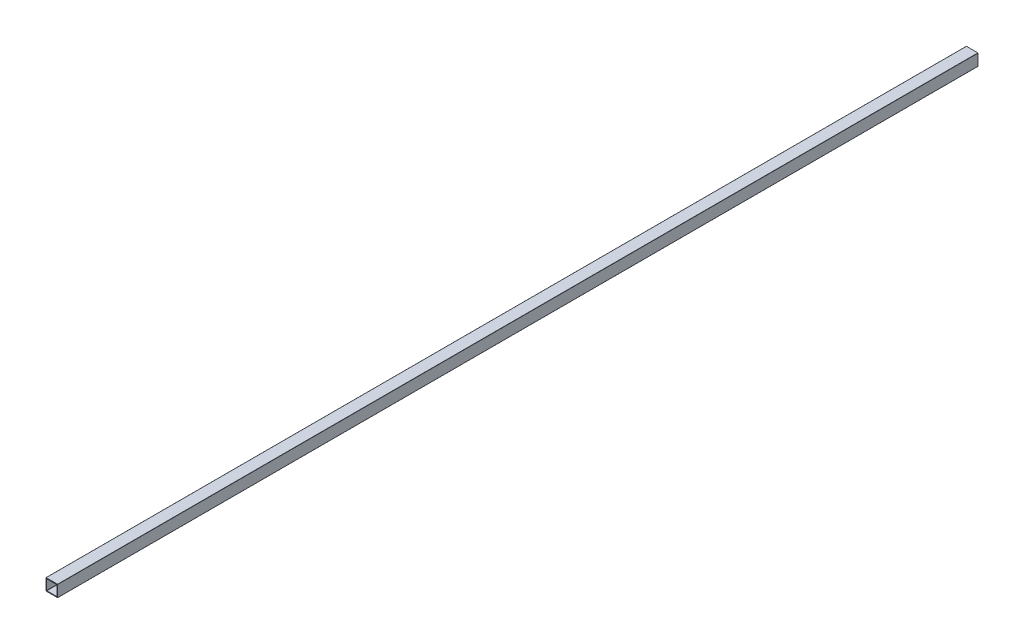
ISO-10303-21;
HEADER;
FILE_DESCRIPTION(('STEP AP214'),'2;1');
FILE_NAME('part.step','',(''),(''),'','','');
FILE_SCHEMA(('AUTOMOTIVE_DESIGN { 1 0 10303 214 1 1 1 1 }'));
ENDSEC;
DATA;
#1=APPLICATION_CONTEXT('core data for automotive mechanical design processes');
#2=APPLICATION_PROTOCOL_DEFINITION('international standard','automotive_design',2000,#1);
#3=PRODUCT_CONTEXT('',#1,'mechanical');
#4=PRODUCT('Part','Part','',(#3));
#5=PRODUCT_RELATED_PRODUCT_CATEGORY('part','',(#4));
#6=PRODUCT_DEFINITION_FORMATION('','',#4);
#7=PRODUCT_DEFINITION_CONTEXT('part definition',#1,'design');
#8=PRODUCT_DEFINITION('design','',#6,#7);
#9=PRODUCT_DEFINITION_SHAPE('','',#8);
#10=(LENGTH_UNIT() NAMED_UNIT(*) SI_UNIT(.MILLI.,.METRE.));
#11=(NAMED_UNIT(*) PLANE_ANGLE_UNIT() SI_UNIT($,.RADIAN.));
#12=(NAMED_UNIT(*) SI_UNIT($,.STERADIAN.) SOLID_ANGLE_UNIT());
#13=UNCERTAINTY_MEASURE_WITH_UNIT(LENGTH_MEASURE(1.E-05),#10,'distance_accuracy_value','');
#14=(GEOMETRIC_REPRESENTATION_CONTEXT(3) GLOBAL_UNCERTAINTY_ASSIGNED_CONTEXT((#13)) GLOBAL_UNIT_ASSIGNED_CONTEXT((#10,
#11,#12)) REPRESENTATION_CONTEXT('',''));
#15=CARTESIAN_POINT('',(0.,0.,0.));
#16=DIRECTION('',(0.,0.,1.));
#17=DIRECTION('',(1.,0.,0.));
#18=AXIS2_PLACEMENT_3D('',#15,#16,#17);
#19=CARTESIAN_POINT('',(38.1,-38.1,-6000.));
#20=DIRECTION('',(1.,0.,0.));
#21=DIRECTION('',(0.,0.,-1.));
#22=AXIS2_PLACEMENT_3D('',#19,#20,#21);
#23=PLANE('',#22);
#24=DIRECTION('',(0.,1.,0.));
#25=VECTOR('',#24,1.);
#26=CARTESIAN_POINT('',(38.1,-38.1,0.));
#27=LINE('',#26,#25);
#28=CARTESIAN_POINT('',(38.1,-37.1,0.));
#29=VERTEX_POINT('',#28);
#30=CARTESIAN_POINT('',(38.1,37.1,0.));
#31=VERTEX_POINT('',#30);
#32=EDGE_CURVE('E197',#29,#31,#27,.T.);
#33=ORIENTED_EDGE('',*,*,#32,.F.);
#34=DIRECTION('',(0.,0.,1.));
#35=VECTOR('',#34,1.);
#36=CARTESIAN_POINT('',(38.1,-37.1,-6000.));
#37=LINE('',#36,#35);
#38=CARTESIAN_POINT('',(38.1,-37.1,-6000.));
#39=VERTEX_POINT('',#38);
#40=EDGE_CURVE('E158',#29,#39,#37,.F.);
#41=ORIENTED_EDGE('',*,*,#40,.T.);
#42=DIRECTION('',(0.,1.,0.));
#43=VECTOR('',#42,1.);
#44=CARTESIAN_POINT('',(38.1,-38.1,-6000.));
#45=LINE('',#44,#43);
#46=CARTESIAN_POINT('',(38.1,37.1,-6000.));
#47=VERTEX_POINT('',#46);
#48=EDGE_CURVE('E185',#39,#47,#45,.T.);
#49=ORIENTED_EDGE('',*,*,#48,.T.);
#50=DIRECTION('',(0.,0.,1.));
#51=VECTOR('',#50,1.);
#52=CARTESIAN_POINT('',(38.1,37.1,-6000.));
#53=LINE('',#52,#51);
#54=EDGE_CURVE('E251',#47,#31,#53,.T.);
#55=ORIENTED_EDGE('',*,*,#54,.T.);
#56=EDGE_LOOP('',(#33,#41,#49,#55));
#57=FACE_BOUND('',#56,.T.);
#58=ADVANCED_FACE('F33',(#57),#23,.T.);
#59=CARTESIAN_POINT('',(-38.1,-38.1,-6000.));
#60=DIRECTION('',(0.,-1.,0.));
#61=DIRECTION('',(0.,0.,-1.));
#62=AXIS2_PLACEMENT_3D('',#59,#60,#61);
#63=PLANE('',#62);
#64=DIRECTION('',(1.,0.,0.));
#65=VECTOR('',#64,1.);
#66=CARTESIAN_POINT('',(-38.1,-38.1,0.));
#67=LINE('',#66,#65);
#68=CARTESIAN_POINT('',(-37.1,-38.1,0.));
#69=VERTEX_POINT('',#68);
#70=CARTESIAN_POINT('',(37.1,-38.1,0.));
#71=VERTEX_POINT('',#70);
#72=EDGE_CURVE('E189',#69,#71,#67,.T.);
#73=ORIENTED_EDGE('',*,*,#72,.F.);
#74=DIRECTION('',(0.,0.,1.));
#75=VECTOR('',#74,1.);
#76=CARTESIAN_POINT('',(-37.1,-38.1,-6000.));
#77=LINE('',#76,#75);
#78=CARTESIAN_POINT('',(-37.1,-38.1,-6000.));
#79=VERTEX_POINT('',#78);
#80=EDGE_CURVE('E238',#69,#79,#77,.F.);
#81=ORIENTED_EDGE('',*,*,#80,.T.);
#82=DIRECTION('',(1.,0.,0.));
#83=VECTOR('',#82,1.);
#84=CARTESIAN_POINT('',(-38.1,-38.1,-6000.));
#85=LINE('',#84,#83);
#86=CARTESIAN_POINT('',(37.1,-38.1,-6000.));
#87=VERTEX_POINT('',#86);
#88=EDGE_CURVE('E194',#79,#87,#85,.T.);
#89=ORIENTED_EDGE('',*,*,#88,.T.);
#90=DIRECTION('',(0.,0.,1.));
#91=VECTOR('',#90,1.);
#92=CARTESIAN_POINT('',(37.1,-38.1,-6000.));
#93=LINE('',#92,#91);
#94=EDGE_CURVE('E235',#87,#71,#93,.T.);
#95=ORIENTED_EDGE('',*,*,#94,.T.);
#96=EDGE_LOOP('',(#73,#81,#89,#95));
#97=FACE_BOUND('',#96,.T.);
#98=ADVANCED_FACE('F305',(#97),#63,.T.);
#99=CARTESIAN_POINT('',(-38.1,-38.1,-6000.));
#100=DIRECTION('',(-1.,0.,0.));
#101=DIRECTION('',(0.,0.,1.));
#102=AXIS2_PLACEMENT_3D('',#99,#100,#101);
#103=PLANE('',#102);
#104=DIRECTION('',(0.,-1.,0.));
#105=VECTOR('',#104,1.);
#106=CARTESIAN_POINT('',(-38.1,-38.1,-6000.));
#107=LINE('',#106,#105);
#108=CARTESIAN_POINT('',(-38.1,37.1,-6000.));
#109=VERTEX_POINT('',#108);
#110=CARTESIAN_POINT('',(-38.1,-37.1,-6000.));
#111=VERTEX_POINT('',#110);
#112=EDGE_CURVE('E191',#109,#111,#107,.T.);
#113=ORIENTED_EDGE('',*,*,#112,.T.);
#114=DIRECTION('',(0.,0.,1.));
#115=VECTOR('',#114,1.);
#116=CARTESIAN_POINT('',(-38.1,-37.1,-6000.));
#117=LINE('',#116,#115);
#118=CARTESIAN_POINT('',(-38.1,-37.1,0.));
#119=VERTEX_POINT('',#118);
#120=EDGE_CURVE('E224',#111,#119,#117,.T.);
#121=ORIENTED_EDGE('',*,*,#120,.T.);
#122=DIRECTION('',(0.,-1.,0.));
#123=VECTOR('',#122,1.);
#124=CARTESIAN_POINT('',(-38.1,-38.1,0.));
#125=LINE('',#124,#123);
#126=CARTESIAN_POINT('',(-38.1,37.1,0.));
#127=VERTEX_POINT('',#126);
#128=EDGE_CURVE('E203',#127,#119,#125,.T.);
#129=ORIENTED_EDGE('',*,*,#128,.F.);
#130=DIRECTION('',(0.,0.,1.));
#131=VECTOR('',#130,1.);
#132=CARTESIAN_POINT('',(-38.1,37.1,-6000.));
#133=LINE('',#132,#131);
#134=EDGE_CURVE('E222',#127,#109,#133,.F.);
#135=ORIENTED_EDGE('',*,*,#134,.T.);
#136=EDGE_LOOP('',(#113,#121,#129,#135));
#137=FACE_BOUND('',#136,.T.);
#138=ADVANCED_FACE('F311',(#137),#103,.T.);
#139=CARTESIAN_POINT('',(-38.1,38.1,-6000.));
#140=DIRECTION('',(0.,1.,0.));
#141=DIRECTION('',(0.,0.,1.));
#142=AXIS2_PLACEMENT_3D('',#139,#140,#141);
#143=PLANE('',#142);
#144=DIRECTION('',(-1.,0.,0.));
#145=VECTOR('',#144,1.);
#146=CARTESIAN_POINT('',(-38.1,38.1,-6000.));
#147=LINE('',#146,#145);
#148=CARTESIAN_POINT('',(37.1,38.1,-6000.));
#149=VERTEX_POINT('',#148);
#150=CARTESIAN_POINT('',(-37.1,38.1,-6000.));
#151=VERTEX_POINT('',#150);
#152=EDGE_CURVE('E188',#149,#151,#147,.T.);
#153=ORIENTED_EDGE('',*,*,#152,.T.);
#154=DIRECTION('',(0.,0.,1.));
#155=VECTOR('',#154,1.);
#156=CARTESIAN_POINT('',(-37.1,38.1,-6000.));
#157=LINE('',#156,#155);
#158=CARTESIAN_POINT('',(-37.1,38.1,0.));
#159=VERTEX_POINT('',#158);
#160=EDGE_CURVE('E248',#151,#159,#157,.T.);
#161=ORIENTED_EDGE('',*,*,#160,.T.);
#162=DIRECTION('',(-1.,0.,0.));
#163=VECTOR('',#162,1.);
#164=CARTESIAN_POINT('',(-38.1,38.1,0.));
#165=LINE('',#164,#163);
#166=CARTESIAN_POINT('',(37.1,38.1,0.));
#167=VERTEX_POINT('',#166);
#168=EDGE_CURVE('E200',#167,#159,#165,.T.);
#169=ORIENTED_EDGE('',*,*,#168,.F.);
#170=DIRECTION('',(0.,0.,1.));
#171=VECTOR('',#170,1.);
#172=CARTESIAN_POINT('',(37.1,38.1,-6000.));
#173=LINE('',#172,#171);
#174=EDGE_CURVE('E55',#167,#149,#173,.F.);
#175=ORIENTED_EDGE('',*,*,#174,.T.);
#176=EDGE_LOOP('',(#153,#161,#169,#175));
#177=FACE_BOUND('',#176,.T.);
#178=ADVANCED_FACE('F316',(#177),#143,.T.);
#179=CARTESIAN_POINT('',(0.,0.,-6000.));
#180=DIRECTION('',(0.,0.,-1.));
#181=DIRECTION('',(-1.,0.,0.));
#182=AXIS2_PLACEMENT_3D('',#179,#180,#181);
#183=PLANE('',#182);
#184=DIRECTION('',(0.,-1.,0.));
#185=VECTOR('',#184,1.);
#186=CARTESIAN_POINT('',(-33.55,-33.55,-6000.));
#187=LINE('',#186,#185);
#188=CARTESIAN_POINT('',(-33.55,32.55,-6000.));
#189=VERTEX_POINT('',#188);
#190=CARTESIAN_POINT('',(-33.55,-32.55,-6000.));
#191=VERTEX_POINT('',#190);
#192=EDGE_CURVE('E167',#189,#191,#187,.T.);
#193=ORIENTED_EDGE('',*,*,#192,.T.);
#194=CARTESIAN_POINT('',(-32.55,-32.55,-6000.));
#195=DIRECTION('',(0.,0.,-1.));
#196=DIRECTION('',(-1.,0.,0.));
#197=AXIS2_PLACEMENT_3D('',#194,#195,#196);
#198=CIRCLE('',#197,1.);
#199=CARTESIAN_POINT('',(-32.55,-33.55,-6000.));
#200=VERTEX_POINT('',#199);
#201=EDGE_CURVE('E11',#191,#200,#198,.F.);
#202=ORIENTED_EDGE('',*,*,#201,.T.);
#203=DIRECTION('',(1.,0.,0.));
#204=VECTOR('',#203,1.);
#205=CARTESIAN_POINT('',(-33.55,-33.55,-6000.));
#206=LINE('',#205,#204);
#207=CARTESIAN_POINT('',(32.55,-33.55,-6000.));
#208=VERTEX_POINT('',#207);
#209=EDGE_CURVE('E175',#200,#208,#206,.T.);
#210=ORIENTED_EDGE('',*,*,#209,.T.);
#211=CARTESIAN_POINT('',(32.55,-32.55,-6000.));
#212=DIRECTION('',(0.,0.,-1.));
#213=DIRECTION('',(-1.,0.,0.));
#214=AXIS2_PLACEMENT_3D('',#211,#212,#213);
#215=CIRCLE('',#214,1.);
#216=CARTESIAN_POINT('',(33.55,-32.55,-6000.));
#217=VERTEX_POINT('',#216);
#218=EDGE_CURVE('E262',#208,#217,#215,.F.);
#219=ORIENTED_EDGE('',*,*,#218,.T.);
#220=DIRECTION('',(0.,1.,0.));
#221=VECTOR('',#220,1.);
#222=CARTESIAN_POINT('',(33.55,-33.55,-6000.));
#223=LINE('',#222,#221);
#224=CARTESIAN_POINT('',(33.55,32.55,-6000.));
#225=VERTEX_POINT('',#224);
#226=EDGE_CURVE('E179',#217,#225,#223,.T.);
#227=ORIENTED_EDGE('',*,*,#226,.T.);
#228=CARTESIAN_POINT('',(32.55,32.55,-6000.));
#229=DIRECTION('',(0.,0.,-1.));
#230=DIRECTION('',(-1.,0.,0.));
#231=AXIS2_PLACEMENT_3D('',#228,#229,#230);
#232=CIRCLE('',#231,1.);
#233=CARTESIAN_POINT('',(32.55,33.55,-6000.));
#234=VERTEX_POINT('',#233);
#235=EDGE_CURVE('E258',#225,#234,#232,.F.);
#236=ORIENTED_EDGE('',*,*,#235,.T.);
#237=DIRECTION('',(-1.,0.,0.));
#238=VECTOR('',#237,1.);
#239=CARTESIAN_POINT('',(-33.55,33.55,-6000.));
#240=LINE('',#239,#238);
#241=CARTESIAN_POINT('',(-32.55,33.55,-6000.));
#242=VERTEX_POINT('',#241);
#243=EDGE_CURVE('E277',#234,#242,#240,.T.);
#244=ORIENTED_EDGE('',*,*,#243,.T.);
#245=CARTESIAN_POINT('',(-32.55,32.55,-6000.));
#246=DIRECTION('',(0.,0.,-1.));
#247=DIRECTION('',(-1.,0.,0.));
#248=AXIS2_PLACEMENT_3D('',#245,#246,#247);
#249=CIRCLE('',#248,1.);
#250=EDGE_CURVE('E157',#242,#189,#249,.F.);
#251=ORIENTED_EDGE('',*,*,#250,.T.);
#252=EDGE_LOOP('',(#193,#202,#210,#219,#227,#236,#244,#251));
#253=FACE_BOUND('',#252,.T.);
#254=ORIENTED_EDGE('',*,*,#88,.F.);
#255=CARTESIAN_POINT('',(-37.1,-37.1,-6000.));
#256=DIRECTION('',(0.,0.,-1.));
#257=DIRECTION('',(-1.,0.,0.));
#258=AXIS2_PLACEMENT_3D('',#255,#256,#257);
#259=CIRCLE('',#258,1.);
#260=EDGE_CURVE('E245',#79,#111,#259,.T.);
#261=ORIENTED_EDGE('',*,*,#260,.T.);
#262=ORIENTED_EDGE('',*,*,#112,.F.);
#263=CARTESIAN_POINT('',(-37.1,37.1,-6000.));
#264=DIRECTION('',(0.,0.,-1.));
#265=DIRECTION('',(-1.,0.,0.));
#266=AXIS2_PLACEMENT_3D('',#263,#264,#265);
#267=CIRCLE('',#266,1.);
#268=EDGE_CURVE('E48',#109,#151,#267,.T.);
#269=ORIENTED_EDGE('',*,*,#268,.T.);
#270=ORIENTED_EDGE('',*,*,#152,.F.);
#271=CARTESIAN_POINT('',(37.1,37.1,-6000.));
#272=DIRECTION('',(0.,0.,-1.));
#273=DIRECTION('',(-1.,0.,0.));
#274=AXIS2_PLACEMENT_3D('',#271,#272,#273);
#275=CIRCLE('',#274,1.);
#276=EDGE_CURVE('E240',#149,#47,#275,.T.);
#277=ORIENTED_EDGE('',*,*,#276,.T.);
#278=ORIENTED_EDGE('',*,*,#48,.F.);
#279=CARTESIAN_POINT('',(37.1,-37.1,-6000.));
#280=DIRECTION('',(0.,0.,-1.));
#281=DIRECTION('',(-1.,0.,0.));
#282=AXIS2_PLACEMENT_3D('',#279,#280,#281);
#283=CIRCLE('',#282,1.);
#284=EDGE_CURVE('E242',#39,#87,#283,.T.);
#285=ORIENTED_EDGE('',*,*,#284,.T.);
#286=EDGE_LOOP('',(#254,#261,#262,#269,#270,#277,#278,#285));
#287=FACE_BOUND('',#286,.T.);
#288=ADVANCED_FACE('F267',(#253,#287),#183,.T.);
#289=CARTESIAN_POINT('',(0.,0.,0.));
#290=DIRECTION('',(0.,0.,-1.));
#291=DIRECTION('',(-1.,0.,0.));
#292=AXIS2_PLACEMENT_3D('',#289,#290,#291);
#293=PLANE('',#292);
#294=DIRECTION('',(0.,1.,0.));
#295=VECTOR('',#294,1.);
#296=CARTESIAN_POINT('',(33.55,-33.55,0.));
#297=LINE('',#296,#295);
#298=CARTESIAN_POINT('',(33.55,-32.55,0.));
#299=VERTEX_POINT('',#298);
#300=CARTESIAN_POINT('',(33.55,32.55,0.));
#301=VERTEX_POINT('',#300);
#302=EDGE_CURVE('E181',#299,#301,#297,.T.);
#303=ORIENTED_EDGE('',*,*,#302,.F.);
#304=CARTESIAN_POINT('',(32.55,-32.55,0.));
#305=DIRECTION('',(0.,0.,-1.));
#306=DIRECTION('',(-1.,0.,0.));
#307=AXIS2_PLACEMENT_3D('',#304,#305,#306);
#308=CIRCLE('',#307,1.);
#309=CARTESIAN_POINT('',(32.55,-33.55,0.));
#310=VERTEX_POINT('',#309);
#311=EDGE_CURVE('E260',#299,#310,#308,.T.);
#312=ORIENTED_EDGE('',*,*,#311,.T.);
#313=DIRECTION('',(1.,0.,0.));
#314=VECTOR('',#313,1.);
#315=CARTESIAN_POINT('',(-33.55,-33.55,0.));
#316=LINE('',#315,#314);
#317=CARTESIAN_POINT('',(-32.55,-33.55,0.));
#318=VERTEX_POINT('',#317);
#319=EDGE_CURVE('E281',#318,#310,#316,.T.);
#320=ORIENTED_EDGE('',*,*,#319,.F.);
#321=CARTESIAN_POINT('',(-32.55,-32.55,0.));
#322=DIRECTION('',(0.,0.,-1.));
#323=DIRECTION('',(-1.,0.,0.));
#324=AXIS2_PLACEMENT_3D('',#321,#322,#323);
#325=CIRCLE('',#324,1.);
#326=CARTESIAN_POINT('',(-33.55,-32.55,0.));
#327=VERTEX_POINT('',#326);
#328=EDGE_CURVE('E41',#318,#327,#325,.T.);
#329=ORIENTED_EDGE('',*,*,#328,.T.);
#330=DIRECTION('',(0.,-1.,0.));
#331=VECTOR('',#330,1.);
#332=CARTESIAN_POINT('',(-33.55,-33.55,0.));
#333=LINE('',#332,#331);
#334=CARTESIAN_POINT('',(-33.55,32.55,0.));
#335=VERTEX_POINT('',#334);
#336=EDGE_CURVE('E164',#335,#327,#333,.T.);
#337=ORIENTED_EDGE('',*,*,#336,.F.);
#338=CARTESIAN_POINT('',(-32.55,32.55,0.));
#339=DIRECTION('',(0.,0.,-1.));
#340=DIRECTION('',(-1.,0.,0.));
#341=AXIS2_PLACEMENT_3D('',#338,#339,#340);
#342=CIRCLE('',#341,1.);
#343=CARTESIAN_POINT('',(-32.55,33.55,0.));
#344=VERTEX_POINT('',#343);
#345=EDGE_CURVE('E147',#335,#344,#342,.T.);
#346=ORIENTED_EDGE('',*,*,#345,.T.);
#347=DIRECTION('',(-1.,0.,0.));
#348=VECTOR('',#347,1.);
#349=CARTESIAN_POINT('',(-33.55,33.55,0.));
#350=LINE('',#349,#348);
#351=CARTESIAN_POINT('',(32.55,33.55,0.));
#352=VERTEX_POINT('',#351);
#353=EDGE_CURVE('E176',#352,#344,#350,.T.);
#354=ORIENTED_EDGE('',*,*,#353,.F.);
#355=CARTESIAN_POINT('',(32.55,32.55,0.));
#356=DIRECTION('',(0.,0.,-1.));
#357=DIRECTION('',(-1.,0.,0.));
#358=AXIS2_PLACEMENT_3D('',#355,#356,#357);
#359=CIRCLE('',#358,1.);
#360=EDGE_CURVE('E256',#352,#301,#359,.T.);
#361=ORIENTED_EDGE('',*,*,#360,.T.);
#362=EDGE_LOOP('',(#303,#312,#320,#329,#337,#346,#354,#361));
#363=FACE_BOUND('',#362,.T.);
#364=ORIENTED_EDGE('',*,*,#128,.T.);
#365=CARTESIAN_POINT('',(-37.1,-37.1,0.));
#366=DIRECTION('',(0.,0.,-1.));
#367=DIRECTION('',(-1.,0.,0.));
#368=AXIS2_PLACEMENT_3D('',#365,#366,#367);
#369=CIRCLE('',#368,1.);
#370=EDGE_CURVE('E233',#119,#69,#369,.F.);
#371=ORIENTED_EDGE('',*,*,#370,.T.);
#372=ORIENTED_EDGE('',*,*,#72,.T.);
#373=CARTESIAN_POINT('',(37.1,-37.1,0.));
#374=DIRECTION('',(0.,0.,-1.));
#375=DIRECTION('',(-1.,0.,0.));
#376=AXIS2_PLACEMENT_3D('',#373,#374,#375);
#377=CIRCLE('',#376,1.);
#378=EDGE_CURVE('E229',#71,#29,#377,.F.);
#379=ORIENTED_EDGE('',*,*,#378,.T.);
#380=ORIENTED_EDGE('',*,*,#32,.T.);
#381=CARTESIAN_POINT('',(37.1,37.1,0.));
#382=DIRECTION('',(0.,0.,-1.));
#383=DIRECTION('',(-1.,0.,0.));
#384=AXIS2_PLACEMENT_3D('',#381,#382,#383);
#385=CIRCLE('',#384,1.);
#386=EDGE_CURVE('E227',#31,#167,#385,.F.);
#387=ORIENTED_EDGE('',*,*,#386,.T.);
#388=ORIENTED_EDGE('',*,*,#168,.T.);
#389=CARTESIAN_POINT('',(-37.1,37.1,0.));
#390=DIRECTION('',(0.,0.,-1.));
#391=DIRECTION('',(-1.,0.,0.));
#392=AXIS2_PLACEMENT_3D('',#389,#390,#391);
#393=CIRCLE('',#392,1.);
#394=EDGE_CURVE('E231',#159,#127,#393,.F.);
#395=ORIENTED_EDGE('',*,*,#394,.T.);
#396=EDGE_LOOP('',(#364,#371,#372,#379,#380,#387,#388,#395));
#397=FACE_BOUND('',#396,.T.);
#398=ADVANCED_FACE('F172',(#363,#397),#293,.F.);
#399=CARTESIAN_POINT('',(-33.55,-33.55,-6000.));
#400=DIRECTION('',(0.,-1.,0.));
#401=DIRECTION('',(0.,0.,-1.));
#402=AXIS2_PLACEMENT_3D('',#399,#400,#401);
#403=PLANE('',#402);
#404=ORIENTED_EDGE('',*,*,#319,.T.);
#405=DIRECTION('',(0.,0.,1.));
#406=VECTOR('',#405,1.);
#407=CARTESIAN_POINT('',(32.55,-33.55,-6000.));
#408=LINE('',#407,#406);
#409=EDGE_CURVE('E220',#310,#208,#408,.F.);
#410=ORIENTED_EDGE('',*,*,#409,.T.);
#411=ORIENTED_EDGE('',*,*,#209,.F.);
#412=DIRECTION('',(0.,0.,1.));
#413=VECTOR('',#412,1.);
#414=CARTESIAN_POINT('',(-32.55,-33.55,0.));
#415=LINE('',#414,#413);
#416=EDGE_CURVE('E217',#200,#318,#415,.T.);
#417=ORIENTED_EDGE('',*,*,#416,.T.);
#418=EDGE_LOOP('',(#404,#410,#411,#417));
#419=FACE_BOUND('',#418,.T.);
#420=ADVANCED_FACE('F283',(#419),#403,.F.);
#421=CARTESIAN_POINT('',(-33.55,-33.55,-6000.));
#422=DIRECTION('',(-1.,0.,0.));
#423=DIRECTION('',(0.,0.,1.));
#424=AXIS2_PLACEMENT_3D('',#421,#422,#423);
#425=PLANE('',#424);
#426=ORIENTED_EDGE('',*,*,#192,.F.);
#427=DIRECTION('',(0.,0.,1.));
#428=VECTOR('',#427,1.);
#429=CARTESIAN_POINT('',(-33.55,32.55,0.));
#430=LINE('',#429,#428);
#431=EDGE_CURVE('E151',#189,#335,#430,.T.);
#432=ORIENTED_EDGE('',*,*,#431,.T.);
#433=ORIENTED_EDGE('',*,*,#336,.T.);
#434=DIRECTION('',(0.,0.,1.));
#435=VECTOR('',#434,1.);
#436=CARTESIAN_POINT('',(-33.55,-32.55,-6000.));
#437=LINE('',#436,#435);
#438=EDGE_CURVE('E169',#327,#191,#437,.F.);
#439=ORIENTED_EDGE('',*,*,#438,.T.);
#440=EDGE_LOOP('',(#426,#432,#433,#439));
#441=FACE_BOUND('',#440,.T.);
#442=ADVANCED_FACE('F163',(#441),#425,.F.);
#443=CARTESIAN_POINT('',(-33.55,33.55,-6000.));
#444=DIRECTION('',(0.,1.,0.));
#445=DIRECTION('',(0.,0.,1.));
#446=AXIS2_PLACEMENT_3D('',#443,#444,#445);
#447=PLANE('',#446);
#448=ORIENTED_EDGE('',*,*,#353,.T.);
#449=DIRECTION('',(0.,0.,1.));
#450=VECTOR('',#449,1.);
#451=CARTESIAN_POINT('',(-32.55,33.55,-6000.));
#452=LINE('',#451,#450);
#453=EDGE_CURVE('E152',#344,#242,#452,.F.);
#454=ORIENTED_EDGE('',*,*,#453,.T.);
#455=ORIENTED_EDGE('',*,*,#243,.F.);
#456=DIRECTION('',(0.,0.,1.));
#457=VECTOR('',#456,1.);
#458=CARTESIAN_POINT('',(32.55,33.55,0.));
#459=LINE('',#458,#457);
#460=EDGE_CURVE('E168',#234,#352,#459,.T.);
#461=ORIENTED_EDGE('',*,*,#460,.T.);
#462=EDGE_LOOP('',(#448,#454,#455,#461));
#463=FACE_BOUND('',#462,.T.);
#464=ADVANCED_FACE('F292',(#463),#447,.F.);
#465=CARTESIAN_POINT('',(33.55,-33.55,-6000.));
#466=DIRECTION('',(1.,0.,0.));
#467=DIRECTION('',(0.,0.,-1.));
#468=AXIS2_PLACEMENT_3D('',#465,#466,#467);
#469=PLANE('',#468);
#470=ORIENTED_EDGE('',*,*,#302,.T.);
#471=DIRECTION('',(0.,0.,1.));
#472=VECTOR('',#471,1.);
#473=CARTESIAN_POINT('',(33.55,32.55,-6000.));
#474=LINE('',#473,#472);
#475=EDGE_CURVE('E215',#301,#225,#474,.F.);
#476=ORIENTED_EDGE('',*,*,#475,.T.);
#477=ORIENTED_EDGE('',*,*,#226,.F.);
#478=DIRECTION('',(0.,0.,1.));
#479=VECTOR('',#478,1.);
#480=CARTESIAN_POINT('',(33.55,-32.55,0.));
#481=LINE('',#480,#479);
#482=EDGE_CURVE('E212',#217,#299,#481,.T.);
#483=ORIENTED_EDGE('',*,*,#482,.T.);
#484=EDGE_LOOP('',(#470,#476,#477,#483));
#485=FACE_BOUND('',#484,.T.);
#486=ADVANCED_FACE('F275',(#485),#469,.F.);
#487=CARTESIAN_POINT('',(-32.55,32.55,-6000.));
#488=DIRECTION('',(0.,0.,-1.));
#489=DIRECTION('',(-1.,0.,0.));
#490=AXIS2_PLACEMENT_3D('',#487,#488,#489);
#491=CYLINDRICAL_SURFACE('',#490,1.);
#492=ORIENTED_EDGE('',*,*,#250,.F.);
#493=ORIENTED_EDGE('',*,*,#453,.F.);
#494=ORIENTED_EDGE('',*,*,#345,.F.);
#495=ORIENTED_EDGE('',*,*,#431,.F.);
#496=EDGE_LOOP('',(#492,#493,#494,#495));
#497=FACE_BOUND('',#496,.T.);
#498=ADVANCED_FACE('F150',(#497),#491,.F.);
#499=CARTESIAN_POINT('',(32.55,32.55,-6000.));
#500=DIRECTION('',(0.,0.,-1.));
#501=DIRECTION('',(-1.,0.,0.));
#502=AXIS2_PLACEMENT_3D('',#499,#500,#501);
#503=CYLINDRICAL_SURFACE('',#502,1.);
#504=ORIENTED_EDGE('',*,*,#235,.F.);
#505=ORIENTED_EDGE('',*,*,#475,.F.);
#506=ORIENTED_EDGE('',*,*,#360,.F.);
#507=ORIENTED_EDGE('',*,*,#460,.F.);
#508=EDGE_LOOP('',(#504,#505,#506,#507));
#509=FACE_BOUND('',#508,.T.);
#510=ADVANCED_FACE('F294',(#509),#503,.F.);
#511=CARTESIAN_POINT('',(32.55,-32.55,-6000.));
#512=DIRECTION('',(0.,0.,-1.));
#513=DIRECTION('',(-1.,0.,0.));
#514=AXIS2_PLACEMENT_3D('',#511,#512,#513);
#515=CYLINDRICAL_SURFACE('',#514,1.);
#516=ORIENTED_EDGE('',*,*,#218,.F.);
#517=ORIENTED_EDGE('',*,*,#409,.F.);
#518=ORIENTED_EDGE('',*,*,#311,.F.);
#519=ORIENTED_EDGE('',*,*,#482,.F.);
#520=EDGE_LOOP('',(#516,#517,#518,#519));
#521=FACE_BOUND('',#520,.T.);
#522=ADVANCED_FACE('F279',(#521),#515,.F.);
#523=CARTESIAN_POINT('',(-37.1,-37.1,-6000.));
#524=DIRECTION('',(0.,0.,1.));
#525=DIRECTION('',(1.,0.,0.));
#526=AXIS2_PLACEMENT_3D('',#523,#524,#525);
#527=CYLINDRICAL_SURFACE('',#526,1.);
#528=ORIENTED_EDGE('',*,*,#260,.F.);
#529=ORIENTED_EDGE('',*,*,#80,.F.);
#530=ORIENTED_EDGE('',*,*,#370,.F.);
#531=ORIENTED_EDGE('',*,*,#120,.F.);
#532=EDGE_LOOP('',(#528,#529,#530,#531));
#533=FACE_BOUND('',#532,.T.);
#534=ADVANCED_FACE('F301',(#533),#527,.T.);
#535=CARTESIAN_POINT('',(-37.1,37.1,-6000.));
#536=DIRECTION('',(0.,0.,1.));
#537=DIRECTION('',(1.,0.,0.));
#538=AXIS2_PLACEMENT_3D('',#535,#536,#537);
#539=CYLINDRICAL_SURFACE('',#538,1.);
#540=ORIENTED_EDGE('',*,*,#268,.F.);
#541=ORIENTED_EDGE('',*,*,#134,.F.);
#542=ORIENTED_EDGE('',*,*,#394,.F.);
#543=ORIENTED_EDGE('',*,*,#160,.F.);
#544=EDGE_LOOP('',(#540,#541,#542,#543));
#545=FACE_BOUND('',#544,.T.);
#546=ADVANCED_FACE('F368',(#545),#539,.T.);
#547=CARTESIAN_POINT('',(-32.55,-32.55,-6000.));
#548=DIRECTION('',(0.,0.,-1.));
#549=DIRECTION('',(-1.,0.,0.));
#550=AXIS2_PLACEMENT_3D('',#547,#548,#549);
#551=CYLINDRICAL_SURFACE('',#550,1.);
#552=ORIENTED_EDGE('',*,*,#201,.F.);
#553=ORIENTED_EDGE('',*,*,#438,.F.);
#554=ORIENTED_EDGE('',*,*,#328,.F.);
#555=ORIENTED_EDGE('',*,*,#416,.F.);
#556=EDGE_LOOP('',(#552,#553,#554,#555));
#557=FACE_BOUND('',#556,.T.);
#558=ADVANCED_FACE('F378',(#557),#551,.F.);
#559=CARTESIAN_POINT('',(37.1,-37.1,-6000.));
#560=DIRECTION('',(0.,0.,1.));
#561=DIRECTION('',(1.,0.,0.));
#562=AXIS2_PLACEMENT_3D('',#559,#560,#561);
#563=CYLINDRICAL_SURFACE('',#562,1.);
#564=ORIENTED_EDGE('',*,*,#284,.F.);
#565=ORIENTED_EDGE('',*,*,#40,.F.);
#566=ORIENTED_EDGE('',*,*,#378,.F.);
#567=ORIENTED_EDGE('',*,*,#94,.F.);
#568=EDGE_LOOP('',(#564,#565,#566,#567));
#569=FACE_BOUND('',#568,.T.);
#570=ADVANCED_FACE('F388',(#569),#563,.T.);
#571=CARTESIAN_POINT('',(37.1,37.1,-6000.));
#572=DIRECTION('',(0.,0.,1.));
#573=DIRECTION('',(1.,0.,0.));
#574=AXIS2_PLACEMENT_3D('',#571,#572,#573);
#575=CYLINDRICAL_SURFACE('',#574,1.);
#576=ORIENTED_EDGE('',*,*,#276,.F.);
#577=ORIENTED_EDGE('',*,*,#174,.F.);
#578=ORIENTED_EDGE('',*,*,#386,.F.);
#579=ORIENTED_EDGE('',*,*,#54,.F.);
#580=EDGE_LOOP('',(#576,#577,#578,#579));
#581=FACE_BOUND('',#580,.T.);
#582=ADVANCED_FACE('F35',(#581),#575,.T.);
#583=CLOSED_SHELL('',(#58,#98,#138,#178,#288,#398,#420,#442,#464,#486,#498,#510,#522,#534,#546,
#558,#570,#582));
#584=MANIFOLD_SOLID_BREP('B2',#583);
#585=ADVANCED_BREP_SHAPE_REPRESENTATION('',(#18,#584),#14);
#586=SHAPE_DEFINITION_REPRESENTATION(#9,#585);
ENDSEC;
END-ISO-10303-21;
